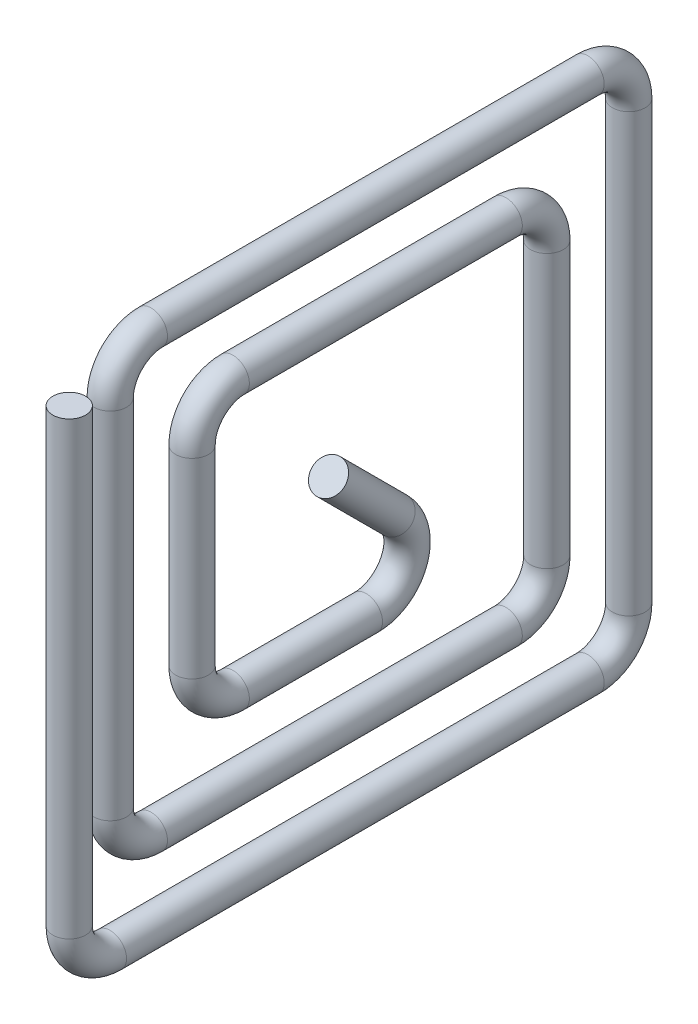
ISO-10303-21;
HEADER;
FILE_DESCRIPTION(('STEP AP214'),'2;1');
FILE_NAME('part.step','',(''),(''),'','','');
FILE_SCHEMA(('AUTOMOTIVE_DESIGN { 1 0 10303 214 1 1 1 1 }'));
ENDSEC;
DATA;
#1=APPLICATION_CONTEXT('core data for automotive mechanical design processes');
#2=APPLICATION_PROTOCOL_DEFINITION('international standard','automotive_design',2000,#1);
#3=PRODUCT_CONTEXT('',#1,'mechanical');
#4=PRODUCT('Part','Part','',(#3));
#5=PRODUCT_RELATED_PRODUCT_CATEGORY('part','',(#4));
#6=PRODUCT_DEFINITION_FORMATION('','',#4);
#7=PRODUCT_DEFINITION_CONTEXT('part definition',#1,'design');
#8=PRODUCT_DEFINITION('design','',#6,#7);
#9=PRODUCT_DEFINITION_SHAPE('','',#8);
#10=(LENGTH_UNIT() NAMED_UNIT(*) SI_UNIT(.MILLI.,.METRE.));
#11=(NAMED_UNIT(*) PLANE_ANGLE_UNIT() SI_UNIT($,.RADIAN.));
#12=(NAMED_UNIT(*) SI_UNIT($,.STERADIAN.) SOLID_ANGLE_UNIT());
#13=UNCERTAINTY_MEASURE_WITH_UNIT(LENGTH_MEASURE(1.E-05),#10,'distance_accuracy_value','');
#14=(GEOMETRIC_REPRESENTATION_CONTEXT(3) GLOBAL_UNCERTAINTY_ASSIGNED_CONTEXT((#13)) GLOBAL_UNIT_ASSIGNED_CONTEXT((#10,
#11,#12)) REPRESENTATION_CONTEXT('',''));
#15=CARTESIAN_POINT('',(0.,0.,0.));
#16=DIRECTION('',(0.,0.,1.));
#17=DIRECTION('',(1.,0.,0.));
#18=AXIS2_PLACEMENT_3D('',#15,#16,#17);
#19=CARTESIAN_POINT('',(0.,-2.43933982822015,-2.43933982822016));
#20=DIRECTION('',(0.,0.707106781186548,0.707106781186547));
#21=DIRECTION('',(0.,-0.707106781186547,0.707106781186548));
#22=AXIS2_PLACEMENT_3D('',#19,#20,#21);
#23=CYLINDRICAL_SURFACE('',#22,0.6);
#24=CARTESIAN_POINT('',(0.,-2.43933982822015,-2.43933982822016));
#25=DIRECTION('',(0.,-0.707106781186424,-0.707106781186671));
#26=DIRECTION('',(0.,0.707106781186671,-0.707106781186424));
#27=AXIS2_PLACEMENT_3D('',#24,#25,#26);
#28=CIRCLE('',#27,0.6);
#29=CARTESIAN_POINT('',(0.,-2.01507575950822,-2.86360389693208));
#30=VERTEX_POINT('',#29);
#31=EDGE_CURVE('E39',#30,#30,#28,.T.);
#32=ORIENTED_EDGE('',*,*,#31,.F.);
#33=EDGE_LOOP('',(#32));
#34=FACE_BOUND('',#33,.T.);
#35=CARTESIAN_POINT('',(0.,0.,0.));
#36=DIRECTION('',(0.,-0.707106781186424,-0.707106781186671));
#37=DIRECTION('',(0.,0.707106781186671,-0.707106781186424));
#38=AXIS2_PLACEMENT_3D('',#35,#36,#37);
#39=CIRCLE('',#38,0.6);
#40=CARTESIAN_POINT('',(0.,0.424264068712004,-0.424264068711865));
#41=VERTEX_POINT('',#40);
#42=EDGE_CURVE('E10',#41,#41,#39,.T.);
#43=ORIENTED_EDGE('',*,*,#42,.T.);
#44=EDGE_LOOP('',(#43));
#45=FACE_BOUND('',#44,.T.);
#46=ADVANCED_FACE('F33',(#34,#45),#23,.T.);
#47=CARTESIAN_POINT('',(0.,-3.5,-1.37867965644036));
#48=DIRECTION('',(1.,0.,0.));
#49=DIRECTION('',(0.,0.,-1.));
#50=AXIS2_PLACEMENT_3D('',#47,#48,#49);
#51=TOROIDAL_SURFACE('',#50,1.50000000000001,0.6);
#52=CARTESIAN_POINT('',(0.,-5.00000000000001,-1.37867965644032));
#53=DIRECTION('',(0.,-1.27124556772277E-13,1.));
#54=DIRECTION('',(0.,-1.,-1.27124556772277E-13));
#55=AXIS2_PLACEMENT_3D('',#52,#53,#54);
#56=CIRCLE('',#55,0.6);
#57=CARTESIAN_POINT('',(0.,-5.6,-1.3786796564403));
#58=VERTEX_POINT('',#57);
#59=EDGE_CURVE('E43',#58,#58,#56,.T.);
#60=CARTESIAN_POINT('',(0.,-3.5,-1.37867965644036));
#61=DIRECTION('',(1.,0.,0.));
#62=DIRECTION('',(0.,0.,-1.));
#63=AXIS2_PLACEMENT_3D('',#60,#61,#62);
#64=CIRCLE('',#63,2.10000000000001);
#65=EDGE_CURVE('',#58,#30,#64,.T.);
#66=ORIENTED_EDGE('',*,*,#59,.F.);
#67=ORIENTED_EDGE('',*,*,#31,.T.);
#68=ORIENTED_EDGE('',*,*,#65,.T.);
#69=ORIENTED_EDGE('',*,*,#65,.F.);
#70=EDGE_LOOP('',(#66,#68,#67,#69));
#71=FACE_BOUND('',#70,.T.);
#72=ADVANCED_FACE('F215',(#71),#51,.T.);
#73=CARTESIAN_POINT('',(0.,-5.00000000000001,3.49999999999999));
#74=DIRECTION('',(0.,0.,-1.));
#75=DIRECTION('',(-1.,0.,0.));
#76=AXIS2_PLACEMENT_3D('',#73,#74,#75);
#77=CYLINDRICAL_SURFACE('',#76,0.6);
#78=CARTESIAN_POINT('',(0.,-5.00000000000001,3.49999999999999));
#79=DIRECTION('',(0.,-1.27124556772277E-13,1.));
#80=DIRECTION('',(0.,-1.,-1.27124556772277E-13));
#81=AXIS2_PLACEMENT_3D('',#78,#79,#80);
#82=CIRCLE('',#81,0.6);
#83=CARTESIAN_POINT('',(0.,-5.6,3.49999999999999));
#84=VERTEX_POINT('',#83);
#85=EDGE_CURVE('E47',#84,#84,#82,.T.);
#86=ORIENTED_EDGE('',*,*,#85,.F.);
#87=EDGE_LOOP('',(#86));
#88=FACE_BOUND('',#87,.T.);
#89=ORIENTED_EDGE('',*,*,#59,.T.);
#90=EDGE_LOOP('',(#89));
#91=FACE_BOUND('',#90,.T.);
#92=ADVANCED_FACE('F209',(#88,#91),#77,.T.);
#93=CARTESIAN_POINT('',(0.,-3.5,3.5));
#94=DIRECTION('',(1.,0.,0.));
#95=DIRECTION('',(0.,0.,-1.));
#96=AXIS2_PLACEMENT_3D('',#93,#94,#95);
#97=TOROIDAL_SURFACE('',#96,1.50000000000001,0.6);
#98=CARTESIAN_POINT('',(0.,-3.49999999999998,5.00000000000001));
#99=DIRECTION('',(0.,1.,1.12752889792107E-13));
#100=DIRECTION('',(0.,-1.12752889792107E-13,1.));
#101=AXIS2_PLACEMENT_3D('',#98,#99,#100);
#102=CIRCLE('',#101,0.6);
#103=CARTESIAN_POINT('',(0.,-3.49999999999998,5.6));
#104=VERTEX_POINT('',#103);
#105=EDGE_CURVE('E52',#104,#104,#102,.T.);
#106=CARTESIAN_POINT('',(0.,-3.5,3.5));
#107=DIRECTION('',(1.,0.,0.));
#108=DIRECTION('',(0.,0.,-1.));
#109=AXIS2_PLACEMENT_3D('',#106,#107,#108);
#110=CIRCLE('',#109,2.10000000000001);
#111=EDGE_CURVE('',#104,#84,#110,.T.);
#112=ORIENTED_EDGE('',*,*,#105,.F.);
#113=ORIENTED_EDGE('',*,*,#85,.T.);
#114=ORIENTED_EDGE('',*,*,#111,.T.);
#115=ORIENTED_EDGE('',*,*,#111,.F.);
#116=EDGE_LOOP('',(#112,#114,#113,#115));
#117=FACE_BOUND('',#116,.T.);
#118=ADVANCED_FACE('F203',(#117),#97,.T.);
#119=CARTESIAN_POINT('',(0.,3.5,5.00000000000001));
#120=DIRECTION('',(0.,-1.,0.));
#121=DIRECTION('',(0.,0.,-1.));
#122=AXIS2_PLACEMENT_3D('',#119,#120,#121);
#123=CYLINDRICAL_SURFACE('',#122,0.6);
#124=CARTESIAN_POINT('',(0.,3.5,5.00000000000001));
#125=DIRECTION('',(0.,1.,1.12752889792107E-13));
#126=DIRECTION('',(0.,-1.12752889792107E-13,1.));
#127=AXIS2_PLACEMENT_3D('',#124,#125,#126);
#128=CIRCLE('',#127,0.6);
#129=CARTESIAN_POINT('',(0.,3.5,5.6));
#130=VERTEX_POINT('',#129);
#131=EDGE_CURVE('E55',#130,#130,#128,.T.);
#132=ORIENTED_EDGE('',*,*,#131,.F.);
#133=EDGE_LOOP('',(#132));
#134=FACE_BOUND('',#133,.T.);
#135=ORIENTED_EDGE('',*,*,#105,.T.);
#136=EDGE_LOOP('',(#135));
#137=FACE_BOUND('',#136,.T.);
#138=ADVANCED_FACE('F197',(#134,#137),#123,.T.);
#139=CARTESIAN_POINT('',(0.,3.5,3.5));
#140=DIRECTION('',(1.,0.,0.));
#141=DIRECTION('',(0.,0.,-1.));
#142=AXIS2_PLACEMENT_3D('',#139,#140,#141);
#143=TOROIDAL_SURFACE('',#142,1.50000000000001,0.6);
#144=CARTESIAN_POINT('',(0.,5.00000000000001,3.49999999999998));
#145=DIRECTION('',(0.,0.,-1.));
#146=DIRECTION('',(0.,1.,0.));
#147=AXIS2_PLACEMENT_3D('',#144,#145,#146);
#148=CIRCLE('',#147,0.6);
#149=CARTESIAN_POINT('',(0.,5.60000000000001,3.49999999999998));
#150=VERTEX_POINT('',#149);
#151=EDGE_CURVE('E58',#150,#150,#148,.T.);
#152=CARTESIAN_POINT('',(0.,3.5,3.5));
#153=DIRECTION('',(1.,0.,0.));
#154=DIRECTION('',(0.,0.,-1.));
#155=AXIS2_PLACEMENT_3D('',#152,#153,#154);
#156=CIRCLE('',#155,2.10000000000001);
#157=EDGE_CURVE('',#150,#130,#156,.T.);
#158=ORIENTED_EDGE('',*,*,#151,.F.);
#159=ORIENTED_EDGE('',*,*,#131,.T.);
#160=ORIENTED_EDGE('',*,*,#157,.T.);
#161=ORIENTED_EDGE('',*,*,#157,.F.);
#162=EDGE_LOOP('',(#158,#160,#159,#161));
#163=FACE_BOUND('',#162,.T.);
#164=ADVANCED_FACE('F191',(#163),#143,.T.);
#165=CARTESIAN_POINT('',(0.,5.00000000000001,-6.49999999999999));
#166=DIRECTION('',(0.,0.,1.));
#167=DIRECTION('',(0.,-1.,0.));
#168=AXIS2_PLACEMENT_3D('',#165,#166,#167);
#169=CYLINDRICAL_SURFACE('',#168,0.6);
#170=CARTESIAN_POINT('',(0.,5.00000000000001,-6.49999999999999));
#171=DIRECTION('',(0.,0.,-1.));
#172=DIRECTION('',(0.,1.,0.));
#173=AXIS2_PLACEMENT_3D('',#170,#171,#172);
#174=CIRCLE('',#173,0.6);
#175=CARTESIAN_POINT('',(0.,5.60000000000001,-6.49999999999999));
#176=VERTEX_POINT('',#175);
#177=EDGE_CURVE('E61',#176,#176,#174,.T.);
#178=ORIENTED_EDGE('',*,*,#177,.F.);
#179=EDGE_LOOP('',(#178));
#180=FACE_BOUND('',#179,.T.);
#181=ORIENTED_EDGE('',*,*,#151,.T.);
#182=EDGE_LOOP('',(#181));
#183=FACE_BOUND('',#182,.T.);
#184=ADVANCED_FACE('F185',(#180,#183),#169,.T.);
#185=CARTESIAN_POINT('',(0.,3.5,-6.5));
#186=DIRECTION('',(1.,0.,0.));
#187=DIRECTION('',(0.,0.,-1.));
#188=AXIS2_PLACEMENT_3D('',#185,#186,#187);
#189=TOROIDAL_SURFACE('',#188,1.50000000000001,0.6);
#190=CARTESIAN_POINT('',(0.,3.49999999999998,-8.));
#191=DIRECTION('',(0.,-1.,0.));
#192=DIRECTION('',(0.,0.,-1.));
#193=AXIS2_PLACEMENT_3D('',#190,#191,#192);
#194=CIRCLE('',#193,0.6);
#195=CARTESIAN_POINT('',(0.,3.49999999999998,-8.6));
#196=VERTEX_POINT('',#195);
#197=EDGE_CURVE('E64',#196,#196,#194,.T.);
#198=CARTESIAN_POINT('',(0.,3.5,-6.5));
#199=DIRECTION('',(1.,0.,0.));
#200=DIRECTION('',(0.,0.,-1.));
#201=AXIS2_PLACEMENT_3D('',#198,#199,#200);
#202=CIRCLE('',#201,2.10000000000001);
#203=EDGE_CURVE('',#196,#176,#202,.T.);
#204=ORIENTED_EDGE('',*,*,#197,.F.);
#205=ORIENTED_EDGE('',*,*,#177,.T.);
#206=ORIENTED_EDGE('',*,*,#203,.T.);
#207=ORIENTED_EDGE('',*,*,#203,.F.);
#208=EDGE_LOOP('',(#204,#206,#205,#207));
#209=FACE_BOUND('',#208,.T.);
#210=ADVANCED_FACE('F179',(#209),#189,.T.);
#211=CARTESIAN_POINT('',(0.,-6.49999999999999,-8.00000000000001));
#212=DIRECTION('',(0.,1.,0.));
#213=DIRECTION('',(0.,0.,1.));
#214=AXIS2_PLACEMENT_3D('',#211,#212,#213);
#215=CYLINDRICAL_SURFACE('',#214,0.6);
#216=CARTESIAN_POINT('',(0.,-6.49999999999999,-8.00000000000001));
#217=DIRECTION('',(0.,-1.,0.));
#218=DIRECTION('',(0.,0.,-1.));
#219=AXIS2_PLACEMENT_3D('',#216,#217,#218);
#220=CIRCLE('',#219,0.6);
#221=CARTESIAN_POINT('',(0.,-6.49999999999999,-8.6));
#222=VERTEX_POINT('',#221);
#223=EDGE_CURVE('E67',#222,#222,#220,.T.);
#224=ORIENTED_EDGE('',*,*,#223,.F.);
#225=EDGE_LOOP('',(#224));
#226=FACE_BOUND('',#225,.T.);
#227=ORIENTED_EDGE('',*,*,#197,.T.);
#228=EDGE_LOOP('',(#227));
#229=FACE_BOUND('',#228,.T.);
#230=ADVANCED_FACE('F173',(#226,#229),#215,.T.);
#231=CARTESIAN_POINT('',(0.,-6.5,-6.5));
#232=DIRECTION('',(1.,0.,0.));
#233=DIRECTION('',(0.,0.,-1.));
#234=AXIS2_PLACEMENT_3D('',#231,#232,#233);
#235=TOROIDAL_SURFACE('',#234,1.5,0.6);
#236=CARTESIAN_POINT('',(0.,-8.00000000000001,-6.49999999999999));
#237=DIRECTION('',(0.,0.,1.));
#238=DIRECTION('',(0.,-1.,0.));
#239=AXIS2_PLACEMENT_3D('',#236,#237,#238);
#240=CIRCLE('',#239,0.6);
#241=CARTESIAN_POINT('',(0.,-8.6,-6.49999999999998));
#242=VERTEX_POINT('',#241);
#243=EDGE_CURVE('E70',#242,#242,#240,.T.);
#244=CARTESIAN_POINT('',(0.,-6.5,-6.5));
#245=DIRECTION('',(1.,0.,0.));
#246=DIRECTION('',(0.,0.,-1.));
#247=AXIS2_PLACEMENT_3D('',#244,#245,#246);
#248=CIRCLE('',#247,2.1);
#249=EDGE_CURVE('',#242,#222,#248,.T.);
#250=ORIENTED_EDGE('',*,*,#243,.F.);
#251=ORIENTED_EDGE('',*,*,#223,.T.);
#252=ORIENTED_EDGE('',*,*,#249,.T.);
#253=ORIENTED_EDGE('',*,*,#249,.F.);
#254=EDGE_LOOP('',(#250,#252,#251,#253));
#255=FACE_BOUND('',#254,.T.);
#256=ADVANCED_FACE('F167',(#255),#235,.T.);
#257=CARTESIAN_POINT('',(0.,-8.00000000000001,6.49999999999999));
#258=DIRECTION('',(0.,0.,-1.));
#259=DIRECTION('',(0.,1.,0.));
#260=AXIS2_PLACEMENT_3D('',#257,#258,#259);
#261=CYLINDRICAL_SURFACE('',#260,0.6);
#262=CARTESIAN_POINT('',(0.,-8.00000000000001,6.49999999999999));
#263=DIRECTION('',(0.,0.,1.));
#264=DIRECTION('',(0.,-1.,0.));
#265=AXIS2_PLACEMENT_3D('',#262,#263,#264);
#266=CIRCLE('',#265,0.6);
#267=CARTESIAN_POINT('',(0.,-8.60000000000001,6.49999999999999));
#268=VERTEX_POINT('',#267);
#269=EDGE_CURVE('E73',#268,#268,#266,.T.);
#270=ORIENTED_EDGE('',*,*,#269,.F.);
#271=EDGE_LOOP('',(#270));
#272=FACE_BOUND('',#271,.T.);
#273=ORIENTED_EDGE('',*,*,#243,.T.);
#274=EDGE_LOOP('',(#273));
#275=FACE_BOUND('',#274,.T.);
#276=ADVANCED_FACE('F161',(#272,#275),#261,.T.);
#277=CARTESIAN_POINT('',(0.,-6.5,6.5));
#278=DIRECTION('',(1.,0.,0.));
#279=DIRECTION('',(0.,0.,-1.));
#280=AXIS2_PLACEMENT_3D('',#277,#278,#279);
#281=TOROIDAL_SURFACE('',#280,1.5,0.6);
#282=CARTESIAN_POINT('',(0.,-6.49999999999999,8.));
#283=DIRECTION('',(0.,1.,0.));
#284=DIRECTION('',(0.,0.,1.));
#285=AXIS2_PLACEMENT_3D('',#282,#283,#284);
#286=CIRCLE('',#285,0.6);
#287=CARTESIAN_POINT('',(0.,-6.49999999999998,8.6));
#288=VERTEX_POINT('',#287);
#289=EDGE_CURVE('E76',#288,#288,#286,.T.);
#290=CARTESIAN_POINT('',(0.,-6.5,6.5));
#291=DIRECTION('',(1.,0.,0.));
#292=DIRECTION('',(0.,0.,-1.));
#293=AXIS2_PLACEMENT_3D('',#290,#291,#292);
#294=CIRCLE('',#293,2.1);
#295=EDGE_CURVE('',#288,#268,#294,.T.);
#296=ORIENTED_EDGE('',*,*,#289,.F.);
#297=ORIENTED_EDGE('',*,*,#269,.T.);
#298=ORIENTED_EDGE('',*,*,#295,.T.);
#299=ORIENTED_EDGE('',*,*,#295,.F.);
#300=EDGE_LOOP('',(#296,#298,#297,#299));
#301=FACE_BOUND('',#300,.T.);
#302=ADVANCED_FACE('F155',(#301),#281,.T.);
#303=CARTESIAN_POINT('',(0.,6.49999999999999,8.));
#304=DIRECTION('',(0.,-1.,0.));
#305=DIRECTION('',(0.,0.,-1.));
#306=AXIS2_PLACEMENT_3D('',#303,#304,#305);
#307=CYLINDRICAL_SURFACE('',#306,0.6);
#308=CARTESIAN_POINT('',(0.,6.49999999999999,8.));
#309=DIRECTION('',(0.,1.,0.));
#310=DIRECTION('',(0.,0.,1.));
#311=AXIS2_PLACEMENT_3D('',#308,#309,#310);
#312=CIRCLE('',#311,0.6);
#313=CARTESIAN_POINT('',(0.,6.49999999999999,8.6));
#314=VERTEX_POINT('',#313);
#315=EDGE_CURVE('E79',#314,#314,#312,.T.);
#316=ORIENTED_EDGE('',*,*,#315,.F.);
#317=EDGE_LOOP('',(#316));
#318=FACE_BOUND('',#317,.T.);
#319=ORIENTED_EDGE('',*,*,#289,.T.);
#320=EDGE_LOOP('',(#319));
#321=FACE_BOUND('',#320,.T.);
#322=ADVANCED_FACE('F149',(#318,#321),#307,.T.);
#323=CARTESIAN_POINT('',(0.,6.5,6.5));
#324=DIRECTION('',(1.,0.,0.));
#325=DIRECTION('',(0.,0.,-1.));
#326=AXIS2_PLACEMENT_3D('',#323,#324,#325);
#327=TOROIDAL_SURFACE('',#326,1.5,0.6);
#328=CARTESIAN_POINT('',(0.,8.,6.49999999999998));
#329=DIRECTION('',(0.,0.,-1.));
#330=DIRECTION('',(0.,1.,0.));
#331=AXIS2_PLACEMENT_3D('',#328,#329,#330);
#332=CIRCLE('',#331,0.6);
#333=CARTESIAN_POINT('',(0.,8.6,6.49999999999998));
#334=VERTEX_POINT('',#333);
#335=EDGE_CURVE('E82',#334,#334,#332,.T.);
#336=CARTESIAN_POINT('',(0.,6.5,6.5));
#337=DIRECTION('',(1.,0.,0.));
#338=DIRECTION('',(0.,0.,-1.));
#339=AXIS2_PLACEMENT_3D('',#336,#337,#338);
#340=CIRCLE('',#339,2.1);
#341=EDGE_CURVE('',#334,#314,#340,.T.);
#342=ORIENTED_EDGE('',*,*,#335,.F.);
#343=ORIENTED_EDGE('',*,*,#315,.T.);
#344=ORIENTED_EDGE('',*,*,#341,.T.);
#345=ORIENTED_EDGE('',*,*,#341,.F.);
#346=EDGE_LOOP('',(#342,#344,#343,#345));
#347=FACE_BOUND('',#346,.T.);
#348=ADVANCED_FACE('F143',(#347),#327,.T.);
#349=CARTESIAN_POINT('',(0.,8.,-9.5));
#350=DIRECTION('',(0.,0.,1.));
#351=DIRECTION('',(1.,0.,0.));
#352=AXIS2_PLACEMENT_3D('',#349,#350,#351);
#353=CYLINDRICAL_SURFACE('',#352,0.6);
#354=CARTESIAN_POINT('',(0.,8.,-9.5));
#355=DIRECTION('',(0.,0.,-1.));
#356=DIRECTION('',(0.,1.,0.));
#357=AXIS2_PLACEMENT_3D('',#354,#355,#356);
#358=CIRCLE('',#357,0.6);
#359=CARTESIAN_POINT('',(0.,8.6,-9.49999999999999));
#360=VERTEX_POINT('',#359);
#361=EDGE_CURVE('E85',#360,#360,#358,.T.);
#362=ORIENTED_EDGE('',*,*,#361,.F.);
#363=EDGE_LOOP('',(#362));
#364=FACE_BOUND('',#363,.T.);
#365=ORIENTED_EDGE('',*,*,#335,.T.);
#366=EDGE_LOOP('',(#365));
#367=FACE_BOUND('',#366,.T.);
#368=ADVANCED_FACE('F137',(#364,#367),#353,.T.);
#369=CARTESIAN_POINT('',(0.,6.5,-9.5));
#370=DIRECTION('',(1.,0.,0.));
#371=DIRECTION('',(0.,0.,-1.));
#372=AXIS2_PLACEMENT_3D('',#369,#370,#371);
#373=TOROIDAL_SURFACE('',#372,1.5,0.6);
#374=CARTESIAN_POINT('',(0.,6.49999999999998,-11.));
#375=DIRECTION('',(0.,-1.,0.));
#376=DIRECTION('',(0.,0.,-1.));
#377=AXIS2_PLACEMENT_3D('',#374,#375,#376);
#378=CIRCLE('',#377,0.6);
#379=CARTESIAN_POINT('',(0.,6.49999999999998,-11.6));
#380=VERTEX_POINT('',#379);
#381=EDGE_CURVE('E88',#380,#380,#378,.T.);
#382=CARTESIAN_POINT('',(0.,6.5,-9.5));
#383=DIRECTION('',(1.,0.,0.));
#384=DIRECTION('',(0.,0.,-1.));
#385=AXIS2_PLACEMENT_3D('',#382,#383,#384);
#386=CIRCLE('',#385,2.1);
#387=EDGE_CURVE('',#380,#360,#386,.T.);
#388=ORIENTED_EDGE('',*,*,#381,.F.);
#389=ORIENTED_EDGE('',*,*,#361,.T.);
#390=ORIENTED_EDGE('',*,*,#387,.T.);
#391=ORIENTED_EDGE('',*,*,#387,.F.);
#392=EDGE_LOOP('',(#388,#390,#389,#391));
#393=FACE_BOUND('',#392,.T.);
#394=ADVANCED_FACE('F131',(#393),#373,.T.);
#395=CARTESIAN_POINT('',(0.,-9.5,-11.));
#396=DIRECTION('',(0.,1.,0.));
#397=DIRECTION('',(0.,0.,1.));
#398=AXIS2_PLACEMENT_3D('',#395,#396,#397);
#399=CYLINDRICAL_SURFACE('',#398,0.6);
#400=CARTESIAN_POINT('',(0.,-9.5,-11.));
#401=DIRECTION('',(0.,-1.,0.));
#402=DIRECTION('',(0.,0.,-1.));
#403=AXIS2_PLACEMENT_3D('',#400,#401,#402);
#404=CIRCLE('',#403,0.6);
#405=CARTESIAN_POINT('',(0.,-9.49999999999999,-11.6));
#406=VERTEX_POINT('',#405);
#407=EDGE_CURVE('E91',#406,#406,#404,.T.);
#408=ORIENTED_EDGE('',*,*,#407,.F.);
#409=EDGE_LOOP('',(#408));
#410=FACE_BOUND('',#409,.T.);
#411=ORIENTED_EDGE('',*,*,#381,.T.);
#412=EDGE_LOOP('',(#411));
#413=FACE_BOUND('',#412,.T.);
#414=ADVANCED_FACE('F125',(#410,#413),#399,.T.);
#415=CARTESIAN_POINT('',(0.,-9.5,-9.5));
#416=DIRECTION('',(1.,0.,0.));
#417=DIRECTION('',(0.,0.,-1.));
#418=AXIS2_PLACEMENT_3D('',#415,#416,#417);
#419=TOROIDAL_SURFACE('',#418,1.5,0.6);
#420=CARTESIAN_POINT('',(0.,-11.,-9.49999999999999));
#421=DIRECTION('',(0.,0.,1.));
#422=DIRECTION('',(0.,-1.,0.));
#423=AXIS2_PLACEMENT_3D('',#420,#421,#422);
#424=CIRCLE('',#423,0.6);
#425=CARTESIAN_POINT('',(0.,-11.6,-9.49999999999998));
#426=VERTEX_POINT('',#425);
#427=EDGE_CURVE('E94',#426,#426,#424,.T.);
#428=CARTESIAN_POINT('',(0.,-9.5,-9.5));
#429=DIRECTION('',(1.,0.,0.));
#430=DIRECTION('',(0.,0.,-1.));
#431=AXIS2_PLACEMENT_3D('',#428,#429,#430);
#432=CIRCLE('',#431,2.1);
#433=EDGE_CURVE('',#426,#406,#432,.T.);
#434=ORIENTED_EDGE('',*,*,#427,.F.);
#435=ORIENTED_EDGE('',*,*,#407,.T.);
#436=ORIENTED_EDGE('',*,*,#433,.T.);
#437=ORIENTED_EDGE('',*,*,#433,.F.);
#438=EDGE_LOOP('',(#434,#436,#435,#437));
#439=FACE_BOUND('',#438,.T.);
#440=ADVANCED_FACE('F119',(#439),#419,.T.);
#441=CARTESIAN_POINT('',(0.,-11.,7.99999999999999));
#442=DIRECTION('',(0.,0.,-1.));
#443=DIRECTION('',(-1.,0.,0.));
#444=AXIS2_PLACEMENT_3D('',#441,#442,#443);
#445=CYLINDRICAL_SURFACE('',#444,0.6);
#446=CARTESIAN_POINT('',(0.,-11.,7.99999999999999));
#447=DIRECTION('',(0.,0.,1.));
#448=DIRECTION('',(0.,-1.,0.));
#449=AXIS2_PLACEMENT_3D('',#446,#447,#448);
#450=CIRCLE('',#449,0.6);
#451=CARTESIAN_POINT('',(0.,-11.6,7.99999999999999));
#452=VERTEX_POINT('',#451);
#453=EDGE_CURVE('E97',#452,#452,#450,.T.);
#454=ORIENTED_EDGE('',*,*,#453,.F.);
#455=EDGE_LOOP('',(#454));
#456=FACE_BOUND('',#455,.T.);
#457=ORIENTED_EDGE('',*,*,#427,.T.);
#458=EDGE_LOOP('',(#457));
#459=FACE_BOUND('',#458,.T.);
#460=ADVANCED_FACE('F113',(#456,#459),#445,.T.);
#461=CARTESIAN_POINT('',(0.,-9.5,8.));
#462=DIRECTION('',(1.,0.,0.));
#463=DIRECTION('',(0.,0.,-1.));
#464=AXIS2_PLACEMENT_3D('',#461,#462,#463);
#465=TOROIDAL_SURFACE('',#464,1.5,0.6);
#466=CARTESIAN_POINT('',(0.,-9.49999999999999,9.5));
#467=DIRECTION('',(0.,1.,0.));
#468=DIRECTION('',(0.,0.,1.));
#469=AXIS2_PLACEMENT_3D('',#466,#467,#468);
#470=CIRCLE('',#469,0.6);
#471=CARTESIAN_POINT('',(0.,-9.49999999999998,10.1));
#472=VERTEX_POINT('',#471);
#473=EDGE_CURVE('E100',#472,#472,#470,.T.);
#474=CARTESIAN_POINT('',(0.,-9.5,8.));
#475=DIRECTION('',(1.,0.,0.));
#476=DIRECTION('',(0.,0.,-1.));
#477=AXIS2_PLACEMENT_3D('',#474,#475,#476);
#478=CIRCLE('',#477,2.1);
#479=EDGE_CURVE('',#472,#452,#478,.T.);
#480=ORIENTED_EDGE('',*,*,#473,.F.);
#481=ORIENTED_EDGE('',*,*,#453,.T.);
#482=ORIENTED_EDGE('',*,*,#479,.T.);
#483=ORIENTED_EDGE('',*,*,#479,.F.);
#484=EDGE_LOOP('',(#480,#482,#481,#483));
#485=FACE_BOUND('',#484,.T.);
#486=ADVANCED_FACE('F110',(#485),#465,.T.);
#487=CARTESIAN_POINT('',(0.,-9.49999999999999,9.5));
#488=DIRECTION('',(0.,1.,0.));
#489=DIRECTION('',(0.,0.,1.));
#490=AXIS2_PLACEMENT_3D('',#487,#488,#489);
#491=CYLINDRICAL_SURFACE('',#490,0.6);
#492=ORIENTED_EDGE('',*,*,#473,.T.);
#493=EDGE_LOOP('',(#492));
#494=FACE_BOUND('',#493,.T.);
#495=CARTESIAN_POINT('',(0.,7.,9.5));
#496=DIRECTION('',(0.,1.,0.));
#497=DIRECTION('',(0.,0.,1.));
#498=AXIS2_PLACEMENT_3D('',#495,#496,#497);
#499=CIRCLE('',#498,0.6);
#500=CARTESIAN_POINT('',(0.,7.,10.1));
#501=VERTEX_POINT('',#500);
#502=EDGE_CURVE('E101',#501,#501,#499,.T.);
#503=ORIENTED_EDGE('',*,*,#502,.F.);
#504=EDGE_LOOP('',(#503));
#505=FACE_BOUND('',#504,.T.);
#506=ADVANCED_FACE('F107',(#494,#505),#491,.T.);
#507=CARTESIAN_POINT('',(0.,0.,0.));
#508=DIRECTION('',(0.,-0.707106781186424,-0.707106781186671));
#509=DIRECTION('',(0.,0.707106781186671,-0.707106781186424));
#510=AXIS2_PLACEMENT_3D('',#507,#508,#509);
#511=PLANE('',#510);
#512=ORIENTED_EDGE('',*,*,#42,.F.);
#513=EDGE_LOOP('',(#512));
#514=FACE_BOUND('',#513,.T.);
#515=ADVANCED_FACE('F227',(#514),#511,.F.);
#516=CARTESIAN_POINT('',(0.,7.,9.5));
#517=DIRECTION('',(0.,1.,0.));
#518=DIRECTION('',(0.,0.,1.));
#519=AXIS2_PLACEMENT_3D('',#516,#517,#518);
#520=PLANE('',#519);
#521=ORIENTED_EDGE('',*,*,#502,.T.);
#522=EDGE_LOOP('',(#521));
#523=FACE_BOUND('',#522,.T.);
#524=ADVANCED_FACE('F228',(#523),#520,.T.);
#525=CLOSED_SHELL('',(#46,#72,#92,#118,#138,#164,#184,#210,#230,#256,#276,#302,#322,#348,#368,
#394,#414,#440,#460,#486,#506,#515,#524));
#526=MANIFOLD_SOLID_BREP('B2',#525);
#527=ADVANCED_BREP_SHAPE_REPRESENTATION('',(#18,#526),#14);
#528=SHAPE_DEFINITION_REPRESENTATION(#9,#527);
ENDSEC;
END-ISO-10303-21;
